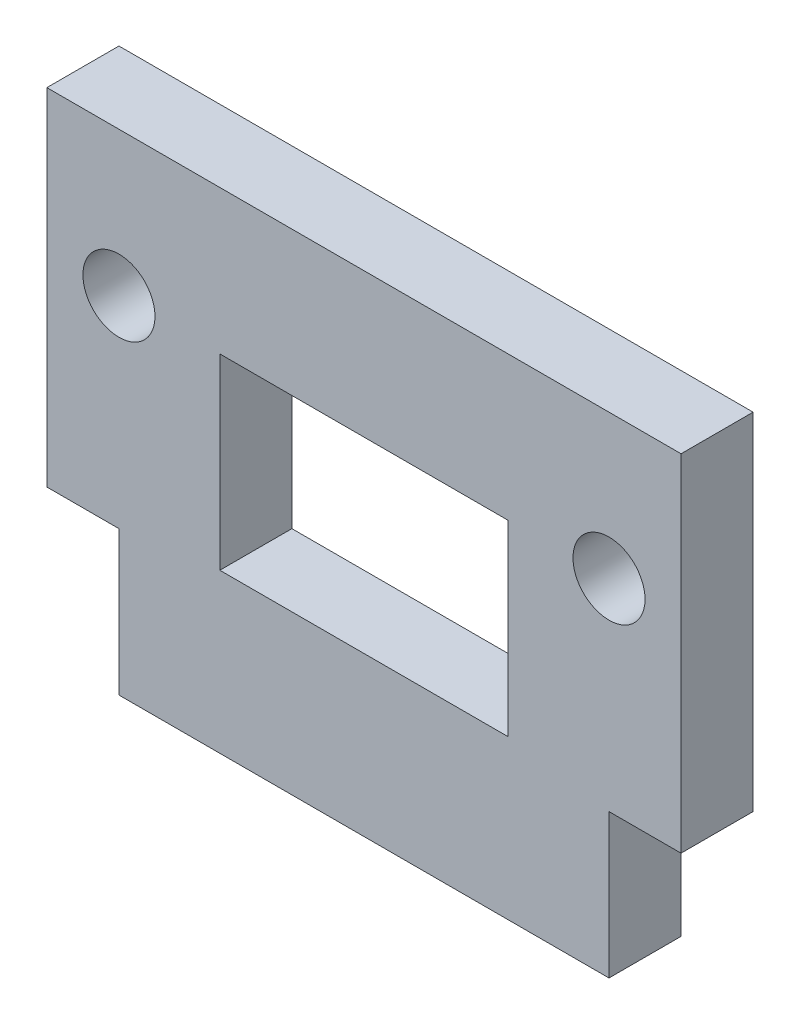
ISO-10303-21;
HEADER;
FILE_DESCRIPTION(('STEP AP214'),'2;1');
FILE_NAME('part.step','',(''),(''),'','','');
FILE_SCHEMA(('AUTOMOTIVE_DESIGN { 1 0 10303 214 1 1 1 1 }'));
ENDSEC;
DATA;
#1=APPLICATION_CONTEXT('core data for automotive mechanical design processes');
#2=APPLICATION_PROTOCOL_DEFINITION('international standard','automotive_design',2000,#1);
#3=PRODUCT_CONTEXT('',#1,'mechanical');
#4=PRODUCT('Part','Part','',(#3));
#5=PRODUCT_RELATED_PRODUCT_CATEGORY('part','',(#4));
#6=PRODUCT_DEFINITION_FORMATION('','',#4);
#7=PRODUCT_DEFINITION_CONTEXT('part definition',#1,'design');
#8=PRODUCT_DEFINITION('design','',#6,#7);
#9=PRODUCT_DEFINITION_SHAPE('','',#8);
#10=(LENGTH_UNIT() NAMED_UNIT(*) SI_UNIT(.MILLI.,.METRE.));
#11=(NAMED_UNIT(*) PLANE_ANGLE_UNIT() SI_UNIT($,.RADIAN.));
#12=(NAMED_UNIT(*) SI_UNIT($,.STERADIAN.) SOLID_ANGLE_UNIT());
#13=UNCERTAINTY_MEASURE_WITH_UNIT(LENGTH_MEASURE(1.E-05),#10,'distance_accuracy_value','');
#14=(GEOMETRIC_REPRESENTATION_CONTEXT(3) GLOBAL_UNCERTAINTY_ASSIGNED_CONTEXT((#13)) GLOBAL_UNIT_ASSIGNED_CONTEXT((#10,
#11,#12)) REPRESENTATION_CONTEXT('',''));
#15=CARTESIAN_POINT('',(0.,0.,0.));
#16=DIRECTION('',(0.,0.,1.));
#17=DIRECTION('',(1.,0.,0.));
#18=AXIS2_PLACEMENT_3D('',#15,#16,#17);
#19=CARTESIAN_POINT('',(5.,0.,2.5));
#20=DIRECTION('',(1.,0.,0.));
#21=DIRECTION('',(0.,1.,0.));
#22=AXIS2_PLACEMENT_3D('',#19,#20,#21);
#23=PLANE('',#22);
#24=DIRECTION('',(0.,-1.,0.));
#25=VECTOR('',#24,1.);
#26=CARTESIAN_POINT('',(5.,0.,0.));
#27=LINE('',#26,#25);
#28=CARTESIAN_POINT('',(5.,-5.,0.));
#29=VERTEX_POINT('',#28);
#30=CARTESIAN_POINT('',(5.,-11.5,0.));
#31=VERTEX_POINT('',#30);
#32=EDGE_CURVE('E185',#29,#31,#27,.T.);
#33=ORIENTED_EDGE('',*,*,#32,.T.);
#34=DIRECTION('',(0.,0.,-1.));
#35=VECTOR('',#34,1.);
#36=CARTESIAN_POINT('',(5.,-11.5,2.5));
#37=LINE('',#36,#35);
#38=CARTESIAN_POINT('',(5.,-11.5,2.5));
#39=VERTEX_POINT('',#38);
#40=EDGE_CURVE('E11',#39,#31,#37,.T.);
#41=ORIENTED_EDGE('',*,*,#40,.F.);
#42=DIRECTION('',(0.,-1.,0.));
#43=VECTOR('',#42,1.);
#44=CARTESIAN_POINT('',(5.,0.,2.5));
#45=LINE('',#44,#43);
#46=CARTESIAN_POINT('',(5.,-5.,2.5));
#47=VERTEX_POINT('',#46);
#48=EDGE_CURVE('E148',#47,#39,#45,.T.);
#49=ORIENTED_EDGE('',*,*,#48,.F.);
#50=DIRECTION('',(0.,0.,-1.));
#51=VECTOR('',#50,1.);
#52=CARTESIAN_POINT('',(5.,-5.,2.5));
#53=LINE('',#52,#51);
#54=EDGE_CURVE('E198',#47,#29,#53,.T.);
#55=ORIENTED_EDGE('',*,*,#54,.T.);
#56=EDGE_LOOP('',(#33,#41,#49,#55));
#57=FACE_BOUND('',#56,.T.);
#58=ADVANCED_FACE('F41',(#57),#23,.F.);
#59=CARTESIAN_POINT('',(0.,-11.5,2.5));
#60=DIRECTION('',(0.,-1.,0.));
#61=DIRECTION('',(1.,0.,0.));
#62=AXIS2_PLACEMENT_3D('',#59,#60,#61);
#63=PLANE('',#62);
#64=DIRECTION('',(-1.,0.,0.));
#65=VECTOR('',#64,1.);
#66=CARTESIAN_POINT('',(0.,-11.5,0.));
#67=LINE('',#66,#65);
#68=CARTESIAN_POINT('',(-5.,-11.5,0.));
#69=VERTEX_POINT('',#68);
#70=EDGE_CURVE('E153',#31,#69,#67,.T.);
#71=ORIENTED_EDGE('',*,*,#70,.T.);
#72=DIRECTION('',(0.,0.,-1.));
#73=VECTOR('',#72,1.);
#74=CARTESIAN_POINT('',(-5.,-11.5,2.5));
#75=LINE('',#74,#73);
#76=CARTESIAN_POINT('',(-5.,-11.5,2.5));
#77=VERTEX_POINT('',#76);
#78=EDGE_CURVE('E51',#77,#69,#75,.T.);
#79=ORIENTED_EDGE('',*,*,#78,.F.);
#80=DIRECTION('',(-1.,0.,0.));
#81=VECTOR('',#80,1.);
#82=CARTESIAN_POINT('',(0.,-11.5,2.5));
#83=LINE('',#82,#81);
#84=EDGE_CURVE('E141',#39,#77,#83,.T.);
#85=ORIENTED_EDGE('',*,*,#84,.F.);
#86=ORIENTED_EDGE('',*,*,#40,.T.);
#87=EDGE_LOOP('',(#71,#79,#85,#86));
#88=FACE_BOUND('',#87,.T.);
#89=ADVANCED_FACE('F152',(#88),#63,.F.);
#90=CARTESIAN_POINT('',(-5.,0.,2.5));
#91=DIRECTION('',(-1.,0.,0.));
#92=DIRECTION('',(0.,0.,1.));
#93=AXIS2_PLACEMENT_3D('',#90,#91,#92);
#94=PLANE('',#93);
#95=DIRECTION('',(0.,1.,0.));
#96=VECTOR('',#95,1.);
#97=CARTESIAN_POINT('',(-5.,0.,0.));
#98=LINE('',#97,#96);
#99=CARTESIAN_POINT('',(-5.,-5.,0.));
#100=VERTEX_POINT('',#99);
#101=EDGE_CURVE('E101',#69,#100,#98,.T.);
#102=ORIENTED_EDGE('',*,*,#101,.T.);
#103=DIRECTION('',(0.,0.,-1.));
#104=VECTOR('',#103,1.);
#105=CARTESIAN_POINT('',(-5.,-5.,2.5));
#106=LINE('',#105,#104);
#107=CARTESIAN_POINT('',(-5.,-5.,2.5));
#108=VERTEX_POINT('',#107);
#109=EDGE_CURVE('E154',#108,#100,#106,.T.);
#110=ORIENTED_EDGE('',*,*,#109,.F.);
#111=DIRECTION('',(0.,1.,0.));
#112=VECTOR('',#111,1.);
#113=CARTESIAN_POINT('',(-5.,0.,2.5));
#114=LINE('',#113,#112);
#115=EDGE_CURVE('E146',#77,#108,#114,.T.);
#116=ORIENTED_EDGE('',*,*,#115,.F.);
#117=ORIENTED_EDGE('',*,*,#78,.T.);
#118=EDGE_LOOP('',(#102,#110,#116,#117));
#119=FACE_BOUND('',#118,.T.);
#120=ADVANCED_FACE('F156',(#119),#94,.F.);
#121=CARTESIAN_POINT('',(-8.50000000000009,0.,2.5));
#122=DIRECTION('',(1.,0.,0.));
#123=DIRECTION('',(0.,1.,0.));
#124=AXIS2_PLACEMENT_3D('',#121,#122,#123);
#125=PLANE('',#124);
#126=DIRECTION('',(0.,-1.,0.));
#127=VECTOR('',#126,1.);
#128=CARTESIAN_POINT('',(-8.50000000000009,0.,0.));
#129=LINE('',#128,#127);
#130=CARTESIAN_POINT('',(-8.50000000000009,-12.,0.));
#131=VERTEX_POINT('',#130);
#132=CARTESIAN_POINT('',(-8.50000000000008,-17.,0.));
#133=VERTEX_POINT('',#132);
#134=EDGE_CURVE('E168',#131,#133,#129,.T.);
#135=ORIENTED_EDGE('',*,*,#134,.T.);
#136=DIRECTION('',(0.,0.,-1.));
#137=VECTOR('',#136,1.);
#138=CARTESIAN_POINT('',(-8.50000000000008,-17.,2.5));
#139=LINE('',#138,#137);
#140=CARTESIAN_POINT('',(-8.50000000000008,-17.,2.5));
#141=VERTEX_POINT('',#140);
#142=EDGE_CURVE('E45',#141,#133,#139,.T.);
#143=ORIENTED_EDGE('',*,*,#142,.F.);
#144=DIRECTION('',(0.,-1.,0.));
#145=VECTOR('',#144,1.);
#146=CARTESIAN_POINT('',(-8.50000000000009,0.,2.5));
#147=LINE('',#146,#145);
#148=CARTESIAN_POINT('',(-8.50000000000009,-12.,2.5));
#149=VERTEX_POINT('',#148);
#150=EDGE_CURVE('E197',#149,#141,#147,.T.);
#151=ORIENTED_EDGE('',*,*,#150,.F.);
#152=DIRECTION('',(0.,0.,-1.));
#153=VECTOR('',#152,1.);
#154=CARTESIAN_POINT('',(-8.50000000000009,-12.,2.5));
#155=LINE('',#154,#153);
#156=EDGE_CURVE('E167',#149,#131,#155,.T.);
#157=ORIENTED_EDGE('',*,*,#156,.T.);
#158=EDGE_LOOP('',(#135,#143,#151,#157));
#159=FACE_BOUND('',#158,.T.);
#160=ADVANCED_FACE('F43',(#159),#125,.F.);
#161=CARTESIAN_POINT('',(0.,-17.,2.5));
#162=DIRECTION('',(0.,1.,0.));
#163=DIRECTION('',(-1.,0.,0.));
#164=AXIS2_PLACEMENT_3D('',#161,#162,#163);
#165=PLANE('',#164);
#166=DIRECTION('',(1.,0.,0.));
#167=VECTOR('',#166,1.);
#168=CARTESIAN_POINT('',(0.,-17.,0.));
#169=LINE('',#168,#167);
#170=CARTESIAN_POINT('',(8.49999999999991,-17.,0.));
#171=VERTEX_POINT('',#170);
#172=EDGE_CURVE('E171',#133,#171,#169,.T.);
#173=ORIENTED_EDGE('',*,*,#172,.T.);
#174=DIRECTION('',(0.,0.,-1.));
#175=VECTOR('',#174,1.);
#176=CARTESIAN_POINT('',(8.49999999999991,-17.,2.5));
#177=LINE('',#176,#175);
#178=CARTESIAN_POINT('',(8.49999999999991,-17.,2.5));
#179=VERTEX_POINT('',#178);
#180=EDGE_CURVE('E217',#179,#171,#177,.T.);
#181=ORIENTED_EDGE('',*,*,#180,.F.);
#182=DIRECTION('',(1.,0.,0.));
#183=VECTOR('',#182,1.);
#184=CARTESIAN_POINT('',(0.,-17.,2.5));
#185=LINE('',#184,#183);
#186=EDGE_CURVE('E116',#141,#179,#185,.T.);
#187=ORIENTED_EDGE('',*,*,#186,.F.);
#188=ORIENTED_EDGE('',*,*,#142,.T.);
#189=EDGE_LOOP('',(#173,#181,#187,#188));
#190=FACE_BOUND('',#189,.T.);
#191=ADVANCED_FACE('F223',(#190),#165,.F.);
#192=CARTESIAN_POINT('',(8.49999999999991,0.,2.5));
#193=DIRECTION('',(-1.,0.,0.));
#194=DIRECTION('',(0.,-1.,0.));
#195=AXIS2_PLACEMENT_3D('',#192,#193,#194);
#196=PLANE('',#195);
#197=DIRECTION('',(0.,1.,0.));
#198=VECTOR('',#197,1.);
#199=CARTESIAN_POINT('',(8.49999999999991,0.,0.));
#200=LINE('',#199,#198);
#201=CARTESIAN_POINT('',(8.49999999999991,-12.,0.));
#202=VERTEX_POINT('',#201);
#203=EDGE_CURVE('E173',#171,#202,#200,.T.);
#204=ORIENTED_EDGE('',*,*,#203,.T.);
#205=DIRECTION('',(0.,0.,-1.));
#206=VECTOR('',#205,1.);
#207=CARTESIAN_POINT('',(8.49999999999991,-12.,2.5));
#208=LINE('',#207,#206);
#209=CARTESIAN_POINT('',(8.49999999999991,-12.,2.5));
#210=VERTEX_POINT('',#209);
#211=EDGE_CURVE('E215',#210,#202,#208,.T.);
#212=ORIENTED_EDGE('',*,*,#211,.F.);
#213=DIRECTION('',(0.,1.,0.));
#214=VECTOR('',#213,1.);
#215=CARTESIAN_POINT('',(8.49999999999991,0.,2.5));
#216=LINE('',#215,#214);
#217=EDGE_CURVE('E245',#179,#210,#216,.T.);
#218=ORIENTED_EDGE('',*,*,#217,.F.);
#219=ORIENTED_EDGE('',*,*,#180,.T.);
#220=EDGE_LOOP('',(#204,#212,#218,#219));
#221=FACE_BOUND('',#220,.T.);
#222=ADVANCED_FACE('F236',(#221),#196,.F.);
#223=CARTESIAN_POINT('',(0.,-12.,2.5));
#224=DIRECTION('',(0.,1.,0.));
#225=DIRECTION('',(-1.,0.,0.));
#226=AXIS2_PLACEMENT_3D('',#223,#224,#225);
#227=PLANE('',#226);
#228=DIRECTION('',(1.,0.,0.));
#229=VECTOR('',#228,1.);
#230=CARTESIAN_POINT('',(0.,-12.,0.));
#231=LINE('',#230,#229);
#232=CARTESIAN_POINT('',(11.,-12.,0.));
#233=VERTEX_POINT('',#232);
#234=EDGE_CURVE('E175',#202,#233,#231,.T.);
#235=ORIENTED_EDGE('',*,*,#234,.T.);
#236=DIRECTION('',(0.,0.,-1.));
#237=VECTOR('',#236,1.);
#238=CARTESIAN_POINT('',(11.,-12.,2.5));
#239=LINE('',#238,#237);
#240=CARTESIAN_POINT('',(11.,-12.,2.5));
#241=VERTEX_POINT('',#240);
#242=EDGE_CURVE('E212',#241,#233,#239,.T.);
#243=ORIENTED_EDGE('',*,*,#242,.F.);
#244=DIRECTION('',(1.,0.,0.));
#245=VECTOR('',#244,1.);
#246=CARTESIAN_POINT('',(0.,-12.,2.5));
#247=LINE('',#246,#245);
#248=EDGE_CURVE('E241',#210,#241,#247,.T.);
#249=ORIENTED_EDGE('',*,*,#248,.F.);
#250=ORIENTED_EDGE('',*,*,#211,.T.);
#251=EDGE_LOOP('',(#235,#243,#249,#250));
#252=FACE_BOUND('',#251,.T.);
#253=ADVANCED_FACE('F239',(#252),#227,.F.);
#254=CARTESIAN_POINT('',(11.,0.,2.5));
#255=DIRECTION('',(-1.,0.,0.));
#256=DIRECTION('',(0.,0.,1.));
#257=AXIS2_PLACEMENT_3D('',#254,#255,#256);
#258=PLANE('',#257);
#259=DIRECTION('',(0.,1.,0.));
#260=VECTOR('',#259,1.);
#261=CARTESIAN_POINT('',(11.,0.,0.));
#262=LINE('',#261,#260);
#263=CARTESIAN_POINT('',(11.,0.,0.));
#264=VERTEX_POINT('',#263);
#265=EDGE_CURVE('E177',#233,#264,#262,.T.);
#266=ORIENTED_EDGE('',*,*,#265,.T.);
#267=DIRECTION('',(0.,0.,-1.));
#268=VECTOR('',#267,1.);
#269=CARTESIAN_POINT('',(11.,0.,2.5));
#270=LINE('',#269,#268);
#271=CARTESIAN_POINT('',(11.,0.,2.5));
#272=VERTEX_POINT('',#271);
#273=EDGE_CURVE('E209',#272,#264,#270,.T.);
#274=ORIENTED_EDGE('',*,*,#273,.F.);
#275=DIRECTION('',(0.,1.,0.));
#276=VECTOR('',#275,1.);
#277=CARTESIAN_POINT('',(11.,0.,2.5));
#278=LINE('',#277,#276);
#279=EDGE_CURVE('E244',#241,#272,#278,.T.);
#280=ORIENTED_EDGE('',*,*,#279,.F.);
#281=ORIENTED_EDGE('',*,*,#242,.T.);
#282=EDGE_LOOP('',(#266,#274,#280,#281));
#283=FACE_BOUND('',#282,.T.);
#284=ADVANCED_FACE('F271',(#283),#258,.F.);
#285=CARTESIAN_POINT('',(0.,0.,2.5));
#286=DIRECTION('',(0.,-1.,0.));
#287=DIRECTION('',(1.,0.,0.));
#288=AXIS2_PLACEMENT_3D('',#285,#286,#287);
#289=PLANE('',#288);
#290=DIRECTION('',(-1.,0.,0.));
#291=VECTOR('',#290,1.);
#292=CARTESIAN_POINT('',(0.,0.,0.));
#293=LINE('',#292,#291);
#294=CARTESIAN_POINT('',(-11.,0.,0.));
#295=VERTEX_POINT('',#294);
#296=EDGE_CURVE('E179',#264,#295,#293,.T.);
#297=ORIENTED_EDGE('',*,*,#296,.T.);
#298=DIRECTION('',(0.,0.,-1.));
#299=VECTOR('',#298,1.);
#300=CARTESIAN_POINT('',(-11.,0.,2.5));
#301=LINE('',#300,#299);
#302=CARTESIAN_POINT('',(-11.,0.,2.5));
#303=VERTEX_POINT('',#302);
#304=EDGE_CURVE('E206',#303,#295,#301,.T.);
#305=ORIENTED_EDGE('',*,*,#304,.F.);
#306=DIRECTION('',(-1.,0.,0.));
#307=VECTOR('',#306,1.);
#308=CARTESIAN_POINT('',(0.,0.,2.5));
#309=LINE('',#308,#307);
#310=EDGE_CURVE('E247',#272,#303,#309,.T.);
#311=ORIENTED_EDGE('',*,*,#310,.F.);
#312=ORIENTED_EDGE('',*,*,#273,.T.);
#313=EDGE_LOOP('',(#297,#305,#311,#312));
#314=FACE_BOUND('',#313,.T.);
#315=ADVANCED_FACE('F267',(#314),#289,.F.);
#316=CARTESIAN_POINT('',(-11.,0.,2.5));
#317=DIRECTION('',(1.,0.,0.));
#318=DIRECTION('',(0.,1.,0.));
#319=AXIS2_PLACEMENT_3D('',#316,#317,#318);
#320=PLANE('',#319);
#321=DIRECTION('',(0.,-1.,0.));
#322=VECTOR('',#321,1.);
#323=CARTESIAN_POINT('',(-11.,0.,0.));
#324=LINE('',#323,#322);
#325=CARTESIAN_POINT('',(-11.,-12.,0.));
#326=VERTEX_POINT('',#325);
#327=EDGE_CURVE('E181',#295,#326,#324,.T.);
#328=ORIENTED_EDGE('',*,*,#327,.T.);
#329=DIRECTION('',(0.,0.,-1.));
#330=VECTOR('',#329,1.);
#331=CARTESIAN_POINT('',(-11.,-12.,2.5));
#332=LINE('',#331,#330);
#333=CARTESIAN_POINT('',(-11.,-12.,2.5));
#334=VERTEX_POINT('',#333);
#335=EDGE_CURVE('E203',#334,#326,#332,.T.);
#336=ORIENTED_EDGE('',*,*,#335,.F.);
#337=DIRECTION('',(0.,-1.,0.));
#338=VECTOR('',#337,1.);
#339=CARTESIAN_POINT('',(-11.,0.,2.5));
#340=LINE('',#339,#338);
#341=EDGE_CURVE('E253',#303,#334,#340,.T.);
#342=ORIENTED_EDGE('',*,*,#341,.F.);
#343=ORIENTED_EDGE('',*,*,#304,.T.);
#344=EDGE_LOOP('',(#328,#336,#342,#343));
#345=FACE_BOUND('',#344,.T.);
#346=ADVANCED_FACE('F263',(#345),#320,.F.);
#347=CARTESIAN_POINT('',(-8.50000000000008,-5.,2.5));
#348=DIRECTION('',(0.,0.,-1.));
#349=DIRECTION('',(-1.,0.,0.));
#350=AXIS2_PLACEMENT_3D('',#347,#348,#349);
#351=CYLINDRICAL_SURFACE('',#350,1.25);
#352=CARTESIAN_POINT('',(-8.50000000000008,-5.,2.5));
#353=DIRECTION('',(0.,0.,1.));
#354=DIRECTION('',(1.,0.,0.));
#355=AXIS2_PLACEMENT_3D('',#352,#353,#354);
#356=CIRCLE('',#355,1.25);
#357=CARTESIAN_POINT('',(-7.25000000000008,-5.,2.5));
#358=VERTEX_POINT('',#357);
#359=EDGE_CURVE('E158',#358,#358,#356,.T.);
#360=ORIENTED_EDGE('',*,*,#359,.T.);
#361=EDGE_LOOP('',(#360));
#362=FACE_BOUND('',#361,.T.);
#363=CARTESIAN_POINT('',(-8.50000000000008,-5.,0.));
#364=DIRECTION('',(0.,0.,1.));
#365=DIRECTION('',(1.,0.,0.));
#366=AXIS2_PLACEMENT_3D('',#363,#364,#365);
#367=CIRCLE('',#366,1.25);
#368=CARTESIAN_POINT('',(-7.25000000000008,-5.,0.));
#369=VERTEX_POINT('',#368);
#370=EDGE_CURVE('E191',#369,#369,#367,.T.);
#371=ORIENTED_EDGE('',*,*,#370,.F.);
#372=EDGE_LOOP('',(#371));
#373=FACE_BOUND('',#372,.T.);
#374=ADVANCED_FACE('F294',(#362,#373),#351,.F.);
#375=CARTESIAN_POINT('',(0.,-5.,2.5));
#376=DIRECTION('',(0.,1.,0.));
#377=DIRECTION('',(-1.,0.,0.));
#378=AXIS2_PLACEMENT_3D('',#375,#376,#377);
#379=PLANE('',#378);
#380=DIRECTION('',(1.,0.,0.));
#381=VECTOR('',#380,1.);
#382=CARTESIAN_POINT('',(0.,-5.,0.));
#383=LINE('',#382,#381);
#384=EDGE_CURVE('E107',#100,#29,#383,.T.);
#385=ORIENTED_EDGE('',*,*,#384,.T.);
#386=ORIENTED_EDGE('',*,*,#54,.F.);
#387=DIRECTION('',(1.,0.,0.));
#388=VECTOR('',#387,1.);
#389=CARTESIAN_POINT('',(0.,-5.,2.5));
#390=LINE('',#389,#388);
#391=EDGE_CURVE('E60',#108,#47,#390,.T.);
#392=ORIENTED_EDGE('',*,*,#391,.F.);
#393=ORIENTED_EDGE('',*,*,#109,.T.);
#394=EDGE_LOOP('',(#385,#386,#392,#393));
#395=FACE_BOUND('',#394,.T.);
#396=ADVANCED_FACE('F292',(#395),#379,.F.);
#397=CARTESIAN_POINT('',(0.,-12.,2.5));
#398=DIRECTION('',(0.,1.,0.));
#399=DIRECTION('',(0.,0.,1.));
#400=AXIS2_PLACEMENT_3D('',#397,#398,#399);
#401=PLANE('',#400);
#402=DIRECTION('',(1.,0.,0.));
#403=VECTOR('',#402,1.);
#404=CARTESIAN_POINT('',(0.,-12.,0.));
#405=LINE('',#404,#403);
#406=EDGE_CURVE('E183',#326,#131,#405,.T.);
#407=ORIENTED_EDGE('',*,*,#406,.T.);
#408=ORIENTED_EDGE('',*,*,#156,.F.);
#409=DIRECTION('',(1.,0.,0.));
#410=VECTOR('',#409,1.);
#411=CARTESIAN_POINT('',(0.,-12.,2.5));
#412=LINE('',#411,#410);
#413=EDGE_CURVE('E255',#334,#149,#412,.T.);
#414=ORIENTED_EDGE('',*,*,#413,.F.);
#415=ORIENTED_EDGE('',*,*,#335,.T.);
#416=EDGE_LOOP('',(#407,#408,#414,#415));
#417=FACE_BOUND('',#416,.T.);
#418=ADVANCED_FACE('F260',(#417),#401,.F.);
#419=CARTESIAN_POINT('',(8.50000000000008,-5.,2.5));
#420=DIRECTION('',(0.,0.,-1.));
#421=DIRECTION('',(-1.,0.,0.));
#422=AXIS2_PLACEMENT_3D('',#419,#420,#421);
#423=CYLINDRICAL_SURFACE('',#422,1.25);
#424=CARTESIAN_POINT('',(8.50000000000008,-5.,2.5));
#425=DIRECTION('',(0.,0.,1.));
#426=DIRECTION('',(1.,0.,0.));
#427=AXIS2_PLACEMENT_3D('',#424,#425,#426);
#428=CIRCLE('',#427,1.25);
#429=CARTESIAN_POINT('',(9.75000000000009,-5.,2.5));
#430=VERTEX_POINT('',#429);
#431=EDGE_CURVE('E164',#430,#430,#428,.F.);
#432=ORIENTED_EDGE('',*,*,#431,.F.);
#433=EDGE_LOOP('',(#432));
#434=FACE_BOUND('',#433,.T.);
#435=CARTESIAN_POINT('',(8.50000000000008,-5.,0.));
#436=DIRECTION('',(0.,0.,1.));
#437=DIRECTION('',(1.,0.,0.));
#438=AXIS2_PLACEMENT_3D('',#435,#436,#437);
#439=CIRCLE('',#438,1.25);
#440=CARTESIAN_POINT('',(9.75000000000009,-5.,0.));
#441=VERTEX_POINT('',#440);
#442=EDGE_CURVE('E194',#441,#441,#439,.F.);
#443=ORIENTED_EDGE('',*,*,#442,.T.);
#444=EDGE_LOOP('',(#443));
#445=FACE_BOUND('',#444,.T.);
#446=ADVANCED_FACE('F291',(#434,#445),#423,.F.);
#447=CARTESIAN_POINT('',(0.,0.,2.5));
#448=DIRECTION('',(0.,0.,1.));
#449=DIRECTION('',(1.,0.,0.));
#450=AXIS2_PLACEMENT_3D('',#447,#448,#449);
#451=PLANE('',#450);
#452=ORIENTED_EDGE('',*,*,#150,.T.);
#453=ORIENTED_EDGE('',*,*,#186,.T.);
#454=ORIENTED_EDGE('',*,*,#217,.T.);
#455=ORIENTED_EDGE('',*,*,#248,.T.);
#456=ORIENTED_EDGE('',*,*,#279,.T.);
#457=ORIENTED_EDGE('',*,*,#310,.T.);
#458=ORIENTED_EDGE('',*,*,#341,.T.);
#459=ORIENTED_EDGE('',*,*,#413,.T.);
#460=EDGE_LOOP('',(#452,#453,#454,#455,#456,#457,#458,#459));
#461=FACE_BOUND('',#460,.T.);
#462=ORIENTED_EDGE('',*,*,#48,.T.);
#463=ORIENTED_EDGE('',*,*,#84,.T.);
#464=ORIENTED_EDGE('',*,*,#115,.T.);
#465=ORIENTED_EDGE('',*,*,#391,.T.);
#466=EDGE_LOOP('',(#462,#463,#464,#465));
#467=FACE_BOUND('',#466,.T.);
#468=ORIENTED_EDGE('',*,*,#359,.F.);
#469=EDGE_LOOP('',(#468));
#470=FACE_BOUND('',#469,.T.);
#471=ORIENTED_EDGE('',*,*,#431,.T.);
#472=EDGE_LOOP('',(#471));
#473=FACE_BOUND('',#472,.T.);
#474=ADVANCED_FACE('F143',(#461,#467,#470,#473),#451,.T.);
#475=CARTESIAN_POINT('',(0.,0.,0.));
#476=DIRECTION('',(0.,0.,1.));
#477=DIRECTION('',(1.,0.,0.));
#478=AXIS2_PLACEMENT_3D('',#475,#476,#477);
#479=PLANE('',#478);
#480=ORIENTED_EDGE('',*,*,#134,.F.);
#481=ORIENTED_EDGE('',*,*,#406,.F.);
#482=ORIENTED_EDGE('',*,*,#327,.F.);
#483=ORIENTED_EDGE('',*,*,#296,.F.);
#484=ORIENTED_EDGE('',*,*,#265,.F.);
#485=ORIENTED_EDGE('',*,*,#234,.F.);
#486=ORIENTED_EDGE('',*,*,#203,.F.);
#487=ORIENTED_EDGE('',*,*,#172,.F.);
#488=EDGE_LOOP('',(#480,#481,#482,#483,#484,#485,#486,#487));
#489=FACE_BOUND('',#488,.T.);
#490=ORIENTED_EDGE('',*,*,#32,.F.);
#491=ORIENTED_EDGE('',*,*,#384,.F.);
#492=ORIENTED_EDGE('',*,*,#101,.F.);
#493=ORIENTED_EDGE('',*,*,#70,.F.);
#494=EDGE_LOOP('',(#490,#491,#492,#493));
#495=FACE_BOUND('',#494,.T.);
#496=ORIENTED_EDGE('',*,*,#370,.T.);
#497=EDGE_LOOP('',(#496));
#498=FACE_BOUND('',#497,.T.);
#499=ORIENTED_EDGE('',*,*,#442,.F.);
#500=EDGE_LOOP('',(#499));
#501=FACE_BOUND('',#500,.T.);
#502=ADVANCED_FACE('F230',(#489,#495,#498,#501),#479,.F.);
#503=CLOSED_SHELL('',(#58,#89,#120,#160,#191,#222,#253,#284,#315,#346,#374,#396,#418,#446,#474,#502));
#504=MANIFOLD_SOLID_BREP('B2',#503);
#505=ADVANCED_BREP_SHAPE_REPRESENTATION('',(#18,#504),#14);
#506=SHAPE_DEFINITION_REPRESENTATION(#9,#505);
ENDSEC;
END-ISO-10303-21;
